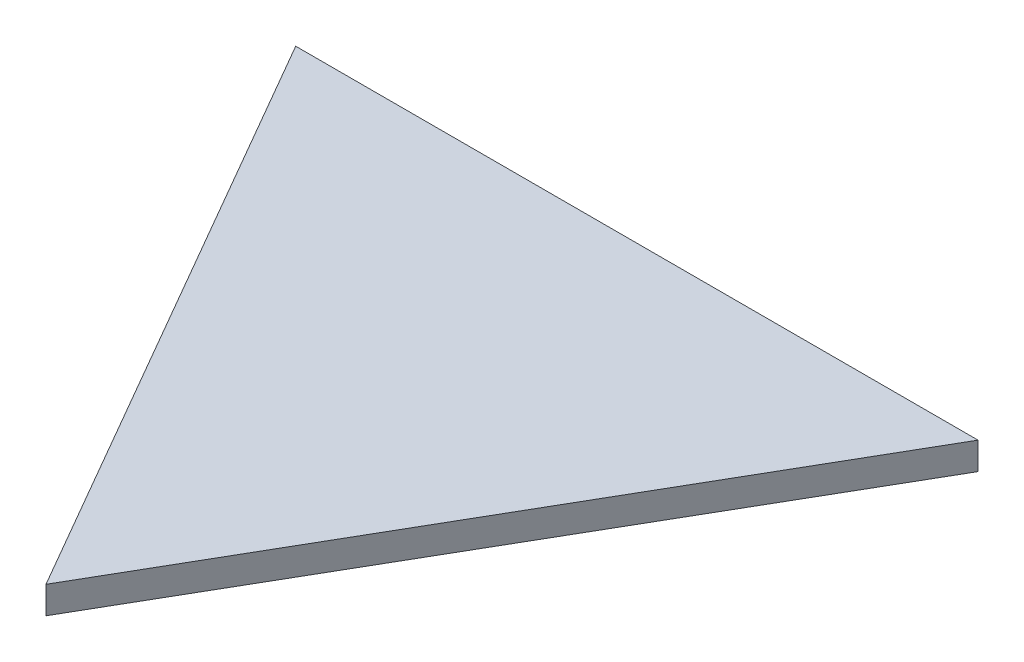
ISO-10303-21;
HEADER;
FILE_DESCRIPTION(('STEP AP214'),'2;1');
FILE_NAME('part.step','',(''),(''),'','','');
FILE_SCHEMA(('AUTOMOTIVE_DESIGN { 1 0 10303 214 1 1 1 1 }'));
ENDSEC;
DATA;
#1=APPLICATION_CONTEXT('core data for automotive mechanical design processes');
#2=APPLICATION_PROTOCOL_DEFINITION('international standard','automotive_design',2000,#1);
#3=PRODUCT_CONTEXT('',#1,'mechanical');
#4=PRODUCT('Part','Part','',(#3));
#5=PRODUCT_RELATED_PRODUCT_CATEGORY('part','',(#4));
#6=PRODUCT_DEFINITION_FORMATION('','',#4);
#7=PRODUCT_DEFINITION_CONTEXT('part definition',#1,'design');
#8=PRODUCT_DEFINITION('design','',#6,#7);
#9=PRODUCT_DEFINITION_SHAPE('','',#8);
#10=(LENGTH_UNIT() NAMED_UNIT(*) SI_UNIT(.MILLI.,.METRE.));
#11=(NAMED_UNIT(*) PLANE_ANGLE_UNIT() SI_UNIT($,.RADIAN.));
#12=(NAMED_UNIT(*) SI_UNIT($,.STERADIAN.) SOLID_ANGLE_UNIT());
#13=UNCERTAINTY_MEASURE_WITH_UNIT(LENGTH_MEASURE(1.E-05),#10,'distance_accuracy_value','');
#14=(GEOMETRIC_REPRESENTATION_CONTEXT(3) GLOBAL_UNCERTAINTY_ASSIGNED_CONTEXT((#13)) GLOBAL_UNIT_ASSIGNED_CONTEXT((#10,
#11,#12)) REPRESENTATION_CONTEXT('',''));
#15=CARTESIAN_POINT('',(0.,0.,0.));
#16=DIRECTION('',(0.,0.,1.));
#17=DIRECTION('',(1.,0.,0.));
#18=AXIS2_PLACEMENT_3D('',#15,#16,#17);
#19=CARTESIAN_POINT('',(158.3235147438,10.,-129.876327536261));
#20=DIRECTION('',(0.866019052628739,0.,0.500011000363013));
#21=DIRECTION('',(0.500011000363013,0.,-0.866019052628739));
#22=AXIS2_PLACEMENT_3D('',#19,#20,#21);
#23=PLANE('',#22);
#24=DIRECTION('',(-0.500011000363013,0.,0.866019052628739));
#25=VECTOR('',#24,1.);
#26=CARTESIAN_POINT('',(158.3235147438,0.,-129.876327536261));
#27=LINE('',#26,#25);
#28=CARTESIAN_POINT('',(125.,0.,-72.16));
#29=VERTEX_POINT('',#28);
#30=CARTESIAN_POINT('',(0.,0.,144.34));
#31=VERTEX_POINT('',#30);
#32=EDGE_CURVE('E70',#29,#31,#27,.T.);
#33=ORIENTED_EDGE('',*,*,#32,.F.);
#34=DIRECTION('',(0.,-1.,0.));
#35=VECTOR('',#34,1.);
#36=CARTESIAN_POINT('',(125.,10.,-72.16));
#37=LINE('',#36,#35);
#38=CARTESIAN_POINT('',(125.,10.,-72.16));
#39=VERTEX_POINT('',#38);
#40=EDGE_CURVE('E11',#39,#29,#37,.T.);
#41=ORIENTED_EDGE('',*,*,#40,.F.);
#42=DIRECTION('',(-0.500011000363013,0.,0.866019052628739));
#43=VECTOR('',#42,1.);
#44=CARTESIAN_POINT('',(158.3235147438,10.,-129.876327536261));
#45=LINE('',#44,#43);
#46=CARTESIAN_POINT('',(0.,10.,144.34));
#47=VERTEX_POINT('',#46);
#48=EDGE_CURVE('E76',#39,#47,#45,.T.);
#49=ORIENTED_EDGE('',*,*,#48,.T.);
#50=DIRECTION('',(0.,-1.,0.));
#51=VECTOR('',#50,1.);
#52=CARTESIAN_POINT('',(0.,10.,144.34));
#53=LINE('',#52,#51);
#54=EDGE_CURVE('E40',#47,#31,#53,.T.);
#55=ORIENTED_EDGE('',*,*,#54,.T.);
#56=EDGE_LOOP('',(#33,#41,#49,#55));
#57=FACE_BOUND('',#56,.T.);
#58=ADVANCED_FACE('F26',(#57),#23,.T.);
#59=CARTESIAN_POINT('',(0.,10.,-72.16));
#60=DIRECTION('',(0.,0.,1.));
#61=DIRECTION('',(1.,0.,0.));
#62=AXIS2_PLACEMENT_3D('',#59,#60,#61);
#63=PLANE('',#62);
#64=DIRECTION('',(-1.,0.,0.));
#65=VECTOR('',#64,1.);
#66=CARTESIAN_POINT('',(0.,0.,-72.16));
#67=LINE('',#66,#65);
#68=CARTESIAN_POINT('',(-125.,0.,-72.16));
#69=VERTEX_POINT('',#68);
#70=EDGE_CURVE('E63',#29,#69,#67,.T.);
#71=ORIENTED_EDGE('',*,*,#70,.T.);
#72=DIRECTION('',(0.,-1.,0.));
#73=VECTOR('',#72,1.);
#74=CARTESIAN_POINT('',(-125.,10.,-72.16));
#75=LINE('',#74,#73);
#76=CARTESIAN_POINT('',(-125.,10.,-72.16));
#77=VERTEX_POINT('',#76);
#78=EDGE_CURVE('E33',#77,#69,#75,.T.);
#79=ORIENTED_EDGE('',*,*,#78,.F.);
#80=DIRECTION('',(-1.,0.,0.));
#81=VECTOR('',#80,1.);
#82=CARTESIAN_POINT('',(0.,10.,-72.16));
#83=LINE('',#82,#81);
#84=EDGE_CURVE('E48',#39,#77,#83,.T.);
#85=ORIENTED_EDGE('',*,*,#84,.F.);
#86=ORIENTED_EDGE('',*,*,#40,.T.);
#87=EDGE_LOOP('',(#71,#79,#85,#86));
#88=FACE_BOUND('',#87,.T.);
#89=ADVANCED_FACE('F62',(#88),#63,.F.);
#90=CARTESIAN_POINT('',(-158.3235147438,10.,-129.876327536261));
#91=DIRECTION('',(-0.866019052628739,0.,0.500011000363013));
#92=DIRECTION('',(0.500011000363013,0.,0.866019052628739));
#93=AXIS2_PLACEMENT_3D('',#90,#91,#92);
#94=PLANE('',#93);
#95=DIRECTION('',(-0.500011000363013,0.,-0.866019052628739));
#96=VECTOR('',#95,1.);
#97=CARTESIAN_POINT('',(-158.3235147438,0.,-129.876327536261));
#98=LINE('',#97,#96);
#99=EDGE_CURVE('E71',#31,#69,#98,.T.);
#100=ORIENTED_EDGE('',*,*,#99,.F.);
#101=ORIENTED_EDGE('',*,*,#54,.F.);
#102=DIRECTION('',(-0.500011000363013,0.,-0.866019052628739));
#103=VECTOR('',#102,1.);
#104=CARTESIAN_POINT('',(-158.3235147438,10.,-129.876327536261));
#105=LINE('',#104,#103);
#106=EDGE_CURVE('E79',#47,#77,#105,.T.);
#107=ORIENTED_EDGE('',*,*,#106,.T.);
#108=ORIENTED_EDGE('',*,*,#78,.T.);
#109=EDGE_LOOP('',(#100,#101,#107,#108));
#110=FACE_BOUND('',#109,.T.);
#111=ADVANCED_FACE('F81',(#110),#94,.T.);
#112=CARTESIAN_POINT('',(0.,10.,-221.287132815591));
#113=DIRECTION('',(0.,-1.,0.));
#114=DIRECTION('',(0.,0.,-1.));
#115=AXIS2_PLACEMENT_3D('',#112,#113,#114);
#116=PLANE('',#115);
#117=ORIENTED_EDGE('',*,*,#48,.F.);
#118=ORIENTED_EDGE('',*,*,#84,.T.);
#119=ORIENTED_EDGE('',*,*,#106,.F.);
#120=EDGE_LOOP('',(#117,#118,#119));
#121=FACE_BOUND('',#120,.T.);
#122=ADVANCED_FACE('F82',(#121),#116,.F.);
#123=CARTESIAN_POINT('',(0.,0.,-221.287132815591));
#124=DIRECTION('',(0.,-1.,0.));
#125=DIRECTION('',(0.,0.,-1.));
#126=AXIS2_PLACEMENT_3D('',#123,#124,#125);
#127=PLANE('',#126);
#128=ORIENTED_EDGE('',*,*,#32,.T.);
#129=ORIENTED_EDGE('',*,*,#99,.T.);
#130=ORIENTED_EDGE('',*,*,#70,.F.);
#131=EDGE_LOOP('',(#128,#129,#130));
#132=FACE_BOUND('',#131,.T.);
#133=ADVANCED_FACE('F69',(#132),#127,.T.);
#134=CLOSED_SHELL('',(#58,#89,#111,#122,#133));
#135=MANIFOLD_SOLID_BREP('B2',#134);
#136=ADVANCED_BREP_SHAPE_REPRESENTATION('',(#18,#135),#14);
#137=SHAPE_DEFINITION_REPRESENTATION(#9,#136);
ENDSEC;
END-ISO-10303-21;
